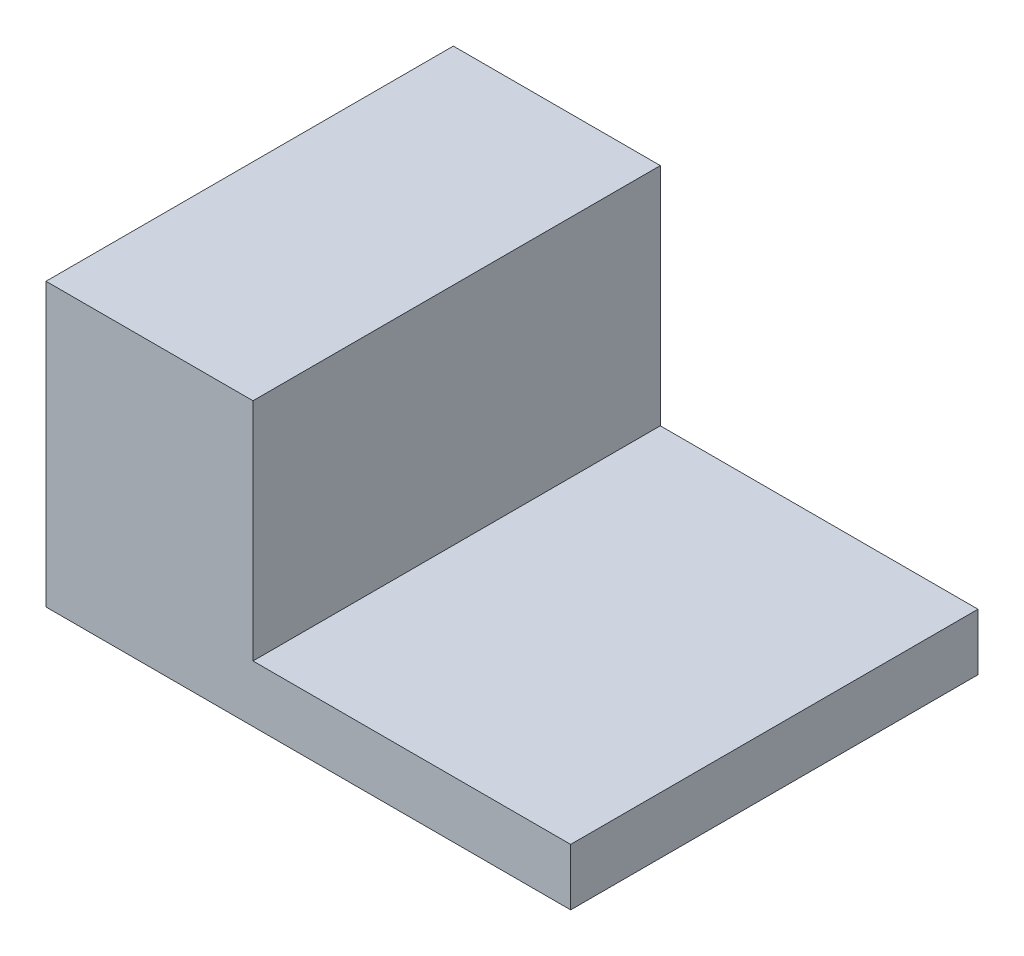
ISO-10303-21;
HEADER;
FILE_DESCRIPTION(('STEP AP214'),'2;1');
FILE_NAME('part.step','',(''),(''),'','','');
FILE_SCHEMA(('AUTOMOTIVE_DESIGN { 1 0 10303 214 1 1 1 1 }'));
ENDSEC;
DATA;
#1=APPLICATION_CONTEXT('core data for automotive mechanical design processes');
#2=APPLICATION_PROTOCOL_DEFINITION('international standard','automotive_design',2000,#1);
#3=PRODUCT_CONTEXT('',#1,'mechanical');
#4=PRODUCT('Part','Part','',(#3));
#5=PRODUCT_RELATED_PRODUCT_CATEGORY('part','',(#4));
#6=PRODUCT_DEFINITION_FORMATION('','',#4);
#7=PRODUCT_DEFINITION_CONTEXT('part definition',#1,'design');
#8=PRODUCT_DEFINITION('design','',#6,#7);
#9=PRODUCT_DEFINITION_SHAPE('','',#8);
#10=(LENGTH_UNIT() NAMED_UNIT(*) SI_UNIT(.MILLI.,.METRE.));
#11=(NAMED_UNIT(*) PLANE_ANGLE_UNIT() SI_UNIT($,.RADIAN.));
#12=(NAMED_UNIT(*) SI_UNIT($,.STERADIAN.) SOLID_ANGLE_UNIT());
#13=UNCERTAINTY_MEASURE_WITH_UNIT(LENGTH_MEASURE(1.E-05),#10,'distance_accuracy_value','');
#14=(GEOMETRIC_REPRESENTATION_CONTEXT(3) GLOBAL_UNCERTAINTY_ASSIGNED_CONTEXT((#13)) GLOBAL_UNIT_ASSIGNED_CONTEXT((#10,
#11,#12)) REPRESENTATION_CONTEXT('',''));
#15=CARTESIAN_POINT('',(0.,0.,0.));
#16=DIRECTION('',(0.,0.,1.));
#17=DIRECTION('',(1.,0.,0.));
#18=AXIS2_PLACEMENT_3D('',#15,#16,#17);
#19=CARTESIAN_POINT('',(25.8133706462628,35.1845427872568,50.8));
#20=DIRECTION('',(0.,-1.,0.));
#21=DIRECTION('',(0.,0.,-1.));
#22=AXIS2_PLACEMENT_3D('',#19,#20,#21);
#23=PLANE('',#22);
#24=DIRECTION('',(-1.,0.,0.));
#25=VECTOR('',#24,1.);
#26=CARTESIAN_POINT('',(25.8133706462628,35.1845427872568,0.));
#27=LINE('',#26,#25);
#28=CARTESIAN_POINT('',(25.8133706462628,35.1845427872568,0.));
#29=VERTEX_POINT('',#28);
#30=CARTESIAN_POINT('',(0.,35.1845427872568,0.));
#31=VERTEX_POINT('',#30);
#32=EDGE_CURVE('E115',#29,#31,#27,.T.);
#33=ORIENTED_EDGE('',*,*,#32,.T.);
#34=DIRECTION('',(0.,0.,-1.));
#35=VECTOR('',#34,1.);
#36=CARTESIAN_POINT('',(0.,35.1845427872568,50.8));
#37=LINE('',#36,#35);
#38=CARTESIAN_POINT('',(0.,35.1845427872568,50.8));
#39=VERTEX_POINT('',#38);
#40=EDGE_CURVE('E11',#39,#31,#37,.T.);
#41=ORIENTED_EDGE('',*,*,#40,.F.);
#42=DIRECTION('',(-1.,0.,0.));
#43=VECTOR('',#42,1.);
#44=CARTESIAN_POINT('',(25.8133706462628,35.1845427872568,50.8));
#45=LINE('',#44,#43);
#46=CARTESIAN_POINT('',(25.8133706462628,35.1845427872568,50.8));
#47=VERTEX_POINT('',#46);
#48=EDGE_CURVE('E125',#47,#39,#45,.T.);
#49=ORIENTED_EDGE('',*,*,#48,.F.);
#50=DIRECTION('',(0.,0.,-1.));
#51=VECTOR('',#50,1.);
#52=CARTESIAN_POINT('',(25.8133706462628,35.1845427872568,50.8));
#53=LINE('',#52,#51);
#54=EDGE_CURVE('E111',#47,#29,#53,.T.);
#55=ORIENTED_EDGE('',*,*,#54,.T.);
#56=EDGE_LOOP('',(#33,#41,#49,#55));
#57=FACE_BOUND('',#56,.T.);
#58=ADVANCED_FACE('F31',(#57),#23,.F.);
#59=CARTESIAN_POINT('',(0.,35.1845427872568,50.8));
#60=DIRECTION('',(1.,0.,0.));
#61=DIRECTION('',(0.,0.,-1.));
#62=AXIS2_PLACEMENT_3D('',#59,#60,#61);
#63=PLANE('',#62);
#64=DIRECTION('',(0.,-1.,0.));
#65=VECTOR('',#64,1.);
#66=CARTESIAN_POINT('',(0.,35.1845427872568,0.));
#67=LINE('',#66,#65);
#68=CARTESIAN_POINT('',(0.,0.,0.));
#69=VERTEX_POINT('',#68);
#70=EDGE_CURVE('E118',#31,#69,#67,.T.);
#71=ORIENTED_EDGE('',*,*,#70,.T.);
#72=DIRECTION('',(0.,0.,-1.));
#73=VECTOR('',#72,1.);
#74=CARTESIAN_POINT('',(0.,0.,50.8));
#75=LINE('',#74,#73);
#76=CARTESIAN_POINT('',(0.,0.,50.8));
#77=VERTEX_POINT('',#76);
#78=EDGE_CURVE('E39',#77,#69,#75,.T.);
#79=ORIENTED_EDGE('',*,*,#78,.F.);
#80=DIRECTION('',(0.,-1.,0.));
#81=VECTOR('',#80,1.);
#82=CARTESIAN_POINT('',(0.,35.1845427872568,50.8));
#83=LINE('',#82,#81);
#84=EDGE_CURVE('E84',#39,#77,#83,.T.);
#85=ORIENTED_EDGE('',*,*,#84,.F.);
#86=ORIENTED_EDGE('',*,*,#40,.T.);
#87=EDGE_LOOP('',(#71,#79,#85,#86));
#88=FACE_BOUND('',#87,.T.);
#89=ADVANCED_FACE('F149',(#88),#63,.F.);
#90=CARTESIAN_POINT('',(0.,0.,50.8));
#91=DIRECTION('',(0.,1.,0.));
#92=DIRECTION('',(0.,0.,1.));
#93=AXIS2_PLACEMENT_3D('',#90,#91,#92);
#94=PLANE('',#93);
#95=DIRECTION('',(1.,0.,0.));
#96=VECTOR('',#95,1.);
#97=CARTESIAN_POINT('',(0.,0.,0.));
#98=LINE('',#97,#96);
#99=CARTESIAN_POINT('',(65.4323548835605,0.,0.));
#100=VERTEX_POINT('',#99);
#101=EDGE_CURVE('E120',#69,#100,#98,.T.);
#102=ORIENTED_EDGE('',*,*,#101,.T.);
#103=DIRECTION('',(0.,0.,-1.));
#104=VECTOR('',#103,1.);
#105=CARTESIAN_POINT('',(65.4323548835605,0.,50.8));
#106=LINE('',#105,#104);
#107=CARTESIAN_POINT('',(65.4323548835605,0.,50.8));
#108=VERTEX_POINT('',#107);
#109=EDGE_CURVE('E106',#108,#100,#106,.T.);
#110=ORIENTED_EDGE('',*,*,#109,.F.);
#111=DIRECTION('',(1.,0.,0.));
#112=VECTOR('',#111,1.);
#113=CARTESIAN_POINT('',(0.,0.,50.8));
#114=LINE('',#113,#112);
#115=EDGE_CURVE('E97',#77,#108,#114,.T.);
#116=ORIENTED_EDGE('',*,*,#115,.F.);
#117=ORIENTED_EDGE('',*,*,#78,.T.);
#118=EDGE_LOOP('',(#102,#110,#116,#117));
#119=FACE_BOUND('',#118,.T.);
#120=ADVANCED_FACE('F131',(#119),#94,.F.);
#121=CARTESIAN_POINT('',(65.4323548835605,0.,50.8));
#122=DIRECTION('',(-1.,0.,0.));
#123=DIRECTION('',(0.,0.,1.));
#124=AXIS2_PLACEMENT_3D('',#121,#122,#123);
#125=PLANE('',#124);
#126=DIRECTION('',(0.,1.,0.));
#127=VECTOR('',#126,1.);
#128=CARTESIAN_POINT('',(65.4323548835605,0.,0.));
#129=LINE('',#128,#127);
#130=CARTESIAN_POINT('',(65.4323548835605,7.07876764455845,0.));
#131=VERTEX_POINT('',#130);
#132=EDGE_CURVE('E105',#100,#131,#129,.T.);
#133=ORIENTED_EDGE('',*,*,#132,.T.);
#134=DIRECTION('',(0.,0.,-1.));
#135=VECTOR('',#134,1.);
#136=CARTESIAN_POINT('',(65.4323548835605,7.07876764455845,50.8));
#137=LINE('',#136,#135);
#138=CARTESIAN_POINT('',(65.4323548835605,7.07876764455845,50.8));
#139=VERTEX_POINT('',#138);
#140=EDGE_CURVE('E102',#139,#131,#137,.T.);
#141=ORIENTED_EDGE('',*,*,#140,.F.);
#142=DIRECTION('',(0.,1.,0.));
#143=VECTOR('',#142,1.);
#144=CARTESIAN_POINT('',(65.4323548835605,0.,50.8));
#145=LINE('',#144,#143);
#146=EDGE_CURVE('E91',#108,#139,#145,.T.);
#147=ORIENTED_EDGE('',*,*,#146,.F.);
#148=ORIENTED_EDGE('',*,*,#109,.T.);
#149=EDGE_LOOP('',(#133,#141,#147,#148));
#150=FACE_BOUND('',#149,.T.);
#151=ADVANCED_FACE('F103',(#150),#125,.F.);
#152=CARTESIAN_POINT('',(65.4323548835605,7.07876764455845,50.8));
#153=DIRECTION('',(0.,-1.,0.));
#154=DIRECTION('',(0.,0.,-1.));
#155=AXIS2_PLACEMENT_3D('',#152,#153,#154);
#156=PLANE('',#155);
#157=DIRECTION('',(-1.,0.,0.));
#158=VECTOR('',#157,1.);
#159=CARTESIAN_POINT('',(65.4323548835605,7.07876764455845,0.));
#160=LINE('',#159,#158);
#161=CARTESIAN_POINT('',(25.8133706462628,7.07876764455845,0.));
#162=VERTEX_POINT('',#161);
#163=EDGE_CURVE('E70',#131,#162,#160,.T.);
#164=ORIENTED_EDGE('',*,*,#163,.T.);
#165=DIRECTION('',(0.,0.,-1.));
#166=VECTOR('',#165,1.);
#167=CARTESIAN_POINT('',(25.8133706462628,7.07876764455845,50.8));
#168=LINE('',#167,#166);
#169=CARTESIAN_POINT('',(25.8133706462628,7.07876764455845,50.8));
#170=VERTEX_POINT('',#169);
#171=EDGE_CURVE('E107',#170,#162,#168,.T.);
#172=ORIENTED_EDGE('',*,*,#171,.F.);
#173=DIRECTION('',(-1.,0.,0.));
#174=VECTOR('',#173,1.);
#175=CARTESIAN_POINT('',(65.4323548835605,7.07876764455845,50.8));
#176=LINE('',#175,#174);
#177=EDGE_CURVE('E95',#139,#170,#176,.T.);
#178=ORIENTED_EDGE('',*,*,#177,.F.);
#179=ORIENTED_EDGE('',*,*,#140,.T.);
#180=EDGE_LOOP('',(#164,#172,#178,#179));
#181=FACE_BOUND('',#180,.T.);
#182=ADVANCED_FACE('F109',(#181),#156,.F.);
#183=CARTESIAN_POINT('',(25.8133706462628,7.07876764455845,50.8));
#184=DIRECTION('',(-1.,0.,0.));
#185=DIRECTION('',(0.,0.,1.));
#186=AXIS2_PLACEMENT_3D('',#183,#184,#185);
#187=PLANE('',#186);
#188=DIRECTION('',(0.,1.,0.));
#189=VECTOR('',#188,1.);
#190=CARTESIAN_POINT('',(25.8133706462628,7.07876764455845,0.));
#191=LINE('',#190,#189);
#192=EDGE_CURVE('E76',#162,#29,#191,.T.);
#193=ORIENTED_EDGE('',*,*,#192,.T.);
#194=ORIENTED_EDGE('',*,*,#54,.F.);
#195=DIRECTION('',(0.,1.,0.));
#196=VECTOR('',#195,1.);
#197=CARTESIAN_POINT('',(25.8133706462628,7.07876764455845,50.8));
#198=LINE('',#197,#196);
#199=EDGE_CURVE('E47',#170,#47,#198,.T.);
#200=ORIENTED_EDGE('',*,*,#199,.F.);
#201=ORIENTED_EDGE('',*,*,#171,.T.);
#202=EDGE_LOOP('',(#193,#194,#200,#201));
#203=FACE_BOUND('',#202,.T.);
#204=ADVANCED_FACE('F138',(#203),#187,.F.);
#205=CARTESIAN_POINT('',(0.,35.1845427872568,50.8));
#206=DIRECTION('',(0.,0.,1.));
#207=DIRECTION('',(1.,0.,0.));
#208=AXIS2_PLACEMENT_3D('',#205,#206,#207);
#209=PLANE('',#208);
#210=ORIENTED_EDGE('',*,*,#48,.T.);
#211=ORIENTED_EDGE('',*,*,#84,.T.);
#212=ORIENTED_EDGE('',*,*,#115,.T.);
#213=ORIENTED_EDGE('',*,*,#146,.T.);
#214=ORIENTED_EDGE('',*,*,#177,.T.);
#215=ORIENTED_EDGE('',*,*,#199,.T.);
#216=EDGE_LOOP('',(#210,#211,#212,#213,#214,#215));
#217=FACE_BOUND('',#216,.T.);
#218=ADVANCED_FACE('F93',(#217),#209,.T.);
#219=CARTESIAN_POINT('',(0.,35.1845427872568,0.));
#220=DIRECTION('',(0.,0.,1.));
#221=DIRECTION('',(1.,0.,0.));
#222=AXIS2_PLACEMENT_3D('',#219,#220,#221);
#223=PLANE('',#222);
#224=ORIENTED_EDGE('',*,*,#32,.F.);
#225=ORIENTED_EDGE('',*,*,#192,.F.);
#226=ORIENTED_EDGE('',*,*,#163,.F.);
#227=ORIENTED_EDGE('',*,*,#132,.F.);
#228=ORIENTED_EDGE('',*,*,#101,.F.);
#229=ORIENTED_EDGE('',*,*,#70,.F.);
#230=EDGE_LOOP('',(#224,#225,#226,#227,#228,#229));
#231=FACE_BOUND('',#230,.T.);
#232=ADVANCED_FACE('F134',(#231),#223,.F.);
#233=CLOSED_SHELL('',(#58,#89,#120,#151,#182,#204,#218,#232));
#234=MANIFOLD_SOLID_BREP('B2',#233);
#235=ADVANCED_BREP_SHAPE_REPRESENTATION('',(#18,#234),#14);
#236=SHAPE_DEFINITION_REPRESENTATION(#9,#235);
ENDSEC;
END-ISO-10303-21;
